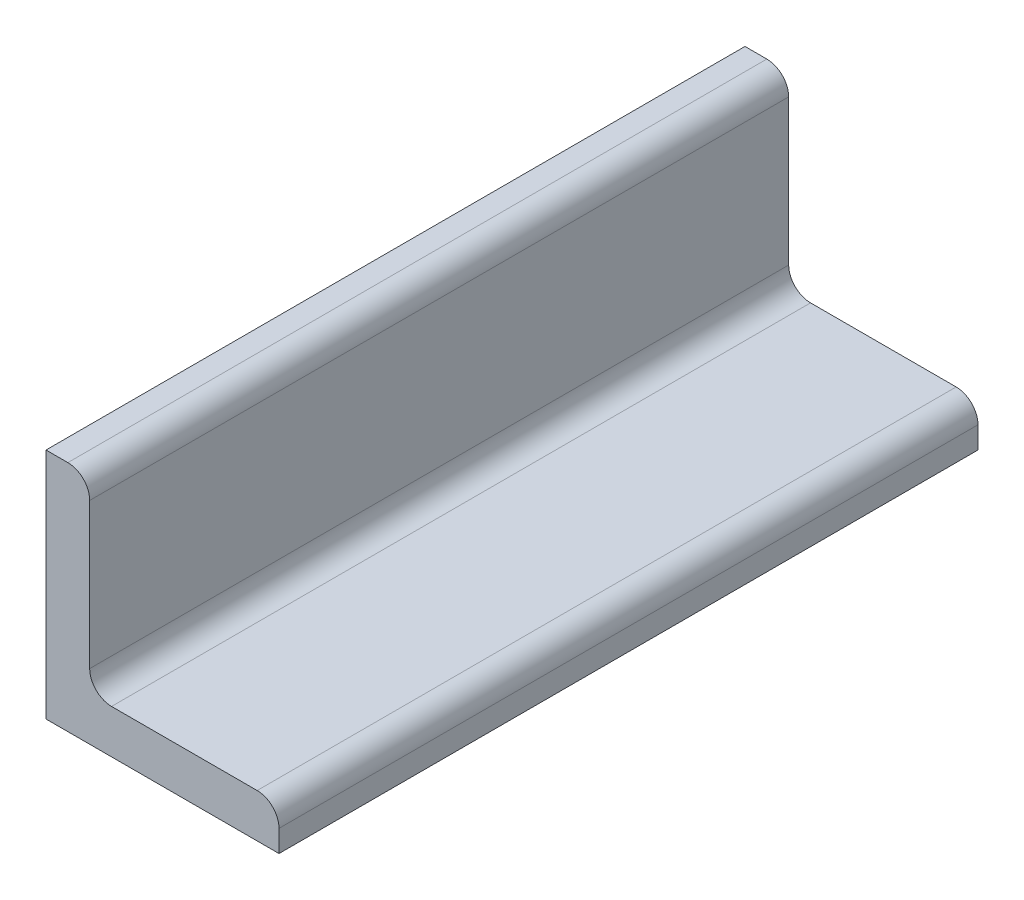
ISO-10303-21;
HEADER;
FILE_DESCRIPTION(('STEP AP214'),'2;1');
FILE_NAME('part.step','',(''),(''),'','','');
FILE_SCHEMA(('AUTOMOTIVE_DESIGN { 1 0 10303 214 1 1 1 1 }'));
ENDSEC;
DATA;
#1=APPLICATION_CONTEXT('core data for automotive mechanical design processes');
#2=APPLICATION_PROTOCOL_DEFINITION('international standard','automotive_design',2000,#1);
#3=PRODUCT_CONTEXT('',#1,'mechanical');
#4=PRODUCT('Part','Part','',(#3));
#5=PRODUCT_RELATED_PRODUCT_CATEGORY('part','',(#4));
#6=PRODUCT_DEFINITION_FORMATION('','',#4);
#7=PRODUCT_DEFINITION_CONTEXT('part definition',#1,'design');
#8=PRODUCT_DEFINITION('design','',#6,#7);
#9=PRODUCT_DEFINITION_SHAPE('','',#8);
#10=(LENGTH_UNIT() NAMED_UNIT(*) SI_UNIT(.MILLI.,.METRE.));
#11=(NAMED_UNIT(*) PLANE_ANGLE_UNIT() SI_UNIT($,.RADIAN.));
#12=(NAMED_UNIT(*) SI_UNIT($,.STERADIAN.) SOLID_ANGLE_UNIT());
#13=UNCERTAINTY_MEASURE_WITH_UNIT(LENGTH_MEASURE(1.E-05),#10,'distance_accuracy_value','');
#14=(GEOMETRIC_REPRESENTATION_CONTEXT(3) GLOBAL_UNCERTAINTY_ASSIGNED_CONTEXT((#13)) GLOBAL_UNIT_ASSIGNED_CONTEXT((#10,
#11,#12)) REPRESENTATION_CONTEXT('',''));
#15=CARTESIAN_POINT('',(0.,0.,0.));
#16=DIRECTION('',(0.,0.,1.));
#17=DIRECTION('',(1.,0.,0.));
#18=AXIS2_PLACEMENT_3D('',#15,#16,#17);
#19=CARTESIAN_POINT('',(0.865045893659089,102.172018782971,304.8));
#20=DIRECTION('',(1.,0.,0.));
#21=DIRECTION('',(0.,0.,-1.));
#22=AXIS2_PLACEMENT_3D('',#19,#20,#21);
#23=PLANE('',#22);
#24=DIRECTION('',(0.,-1.,0.));
#25=VECTOR('',#24,1.);
#26=CARTESIAN_POINT('',(0.865045893659089,102.172018782971,0.));
#27=LINE('',#26,#25);
#28=CARTESIAN_POINT('',(0.865045893659089,102.172018782971,0.));
#29=VERTEX_POINT('',#28);
#30=CARTESIAN_POINT('',(0.865045893659089,0.572018782971054,0.));
#31=VERTEX_POINT('',#30);
#32=EDGE_CURVE('E135',#29,#31,#27,.T.);
#33=ORIENTED_EDGE('',*,*,#32,.T.);
#34=DIRECTION('',(0.,0.,-1.));
#35=VECTOR('',#34,1.);
#36=CARTESIAN_POINT('',(0.865045893659089,0.572018782971054,304.8));
#37=LINE('',#36,#35);
#38=CARTESIAN_POINT('',(0.865045893659089,0.572018782971054,304.8));
#39=VERTEX_POINT('',#38);
#40=EDGE_CURVE('E11',#39,#31,#37,.T.);
#41=ORIENTED_EDGE('',*,*,#40,.F.);
#42=DIRECTION('',(0.,-1.,0.));
#43=VECTOR('',#42,1.);
#44=CARTESIAN_POINT('',(0.865045893659089,102.172018782971,304.8));
#45=LINE('',#44,#43);
#46=CARTESIAN_POINT('',(0.865045893659089,102.172018782971,304.8));
#47=VERTEX_POINT('',#46);
#48=EDGE_CURVE('E151',#47,#39,#45,.T.);
#49=ORIENTED_EDGE('',*,*,#48,.F.);
#50=DIRECTION('',(0.,0.,-1.));
#51=VECTOR('',#50,1.);
#52=CARTESIAN_POINT('',(0.865045893659089,102.172018782971,304.8));
#53=LINE('',#52,#51);
#54=EDGE_CURVE('E131',#47,#29,#53,.T.);
#55=ORIENTED_EDGE('',*,*,#54,.T.);
#56=EDGE_LOOP('',(#33,#41,#49,#55));
#57=FACE_BOUND('',#56,.T.);
#58=ADVANCED_FACE('F33',(#57),#23,.F.);
#59=CARTESIAN_POINT('',(0.865045893659089,0.572018782971054,304.8));
#60=DIRECTION('',(0.,1.,0.));
#61=DIRECTION('',(0.,0.,1.));
#62=AXIS2_PLACEMENT_3D('',#59,#60,#61);
#63=PLANE('',#62);
#64=DIRECTION('',(1.,0.,0.));
#65=VECTOR('',#64,1.);
#66=CARTESIAN_POINT('',(0.865045893659089,0.572018782971054,0.));
#67=LINE('',#66,#65);
#68=CARTESIAN_POINT('',(102.465045893659,0.572018782971054,0.));
#69=VERTEX_POINT('',#68);
#70=EDGE_CURVE('E138',#31,#69,#67,.T.);
#71=ORIENTED_EDGE('',*,*,#70,.T.);
#72=DIRECTION('',(0.,0.,-1.));
#73=VECTOR('',#72,1.);
#74=CARTESIAN_POINT('',(102.465045893659,0.572018782971054,304.8));
#75=LINE('',#74,#73);
#76=CARTESIAN_POINT('',(102.465045893659,0.572018782971054,304.8));
#77=VERTEX_POINT('',#76);
#78=EDGE_CURVE('E41',#77,#69,#75,.T.);
#79=ORIENTED_EDGE('',*,*,#78,.F.);
#80=DIRECTION('',(1.,0.,0.));
#81=VECTOR('',#80,1.);
#82=CARTESIAN_POINT('',(0.865045893659089,0.572018782971054,304.8));
#83=LINE('',#82,#81);
#84=EDGE_CURVE('E95',#39,#77,#83,.T.);
#85=ORIENTED_EDGE('',*,*,#84,.F.);
#86=ORIENTED_EDGE('',*,*,#40,.T.);
#87=EDGE_LOOP('',(#71,#79,#85,#86));
#88=FACE_BOUND('',#87,.T.);
#89=ADVANCED_FACE('F194',(#88),#63,.F.);
#90=CARTESIAN_POINT('',(102.465045893659,0.572018782971054,304.8));
#91=DIRECTION('',(-1.,0.,0.));
#92=DIRECTION('',(0.,0.,1.));
#93=AXIS2_PLACEMENT_3D('',#90,#91,#92);
#94=PLANE('',#93);
#95=DIRECTION('',(0.,1.,0.));
#96=VECTOR('',#95,1.);
#97=CARTESIAN_POINT('',(102.465045893659,0.572018782971054,0.));
#98=LINE('',#97,#96);
#99=CARTESIAN_POINT('',(102.465045893659,10.0970187829711,0.));
#100=VERTEX_POINT('',#99);
#101=EDGE_CURVE('E140',#69,#100,#98,.T.);
#102=ORIENTED_EDGE('',*,*,#101,.T.);
#103=DIRECTION('',(0.,0.,-1.));
#104=VECTOR('',#103,1.);
#105=CARTESIAN_POINT('',(102.465045893659,10.0970187829711,304.8));
#106=LINE('',#105,#104);
#107=CARTESIAN_POINT('',(102.465045893659,10.0970187829711,304.8));
#108=VERTEX_POINT('',#107);
#109=EDGE_CURVE('E161',#108,#100,#106,.T.);
#110=ORIENTED_EDGE('',*,*,#109,.F.);
#111=DIRECTION('',(0.,1.,0.));
#112=VECTOR('',#111,1.);
#113=CARTESIAN_POINT('',(102.465045893659,0.572018782971054,304.8));
#114=LINE('',#113,#112);
#115=EDGE_CURVE('E169',#77,#108,#114,.T.);
#116=ORIENTED_EDGE('',*,*,#115,.F.);
#117=ORIENTED_EDGE('',*,*,#78,.T.);
#118=EDGE_LOOP('',(#102,#110,#116,#117));
#119=FACE_BOUND('',#118,.T.);
#120=ADVANCED_FACE('F167',(#119),#94,.F.);
#121=CARTESIAN_POINT('',(92.9400458936591,10.097018782971,304.8));
#122=DIRECTION('',(0.,0.,-1.));
#123=DIRECTION('',(-1.,0.,0.));
#124=AXIS2_PLACEMENT_3D('',#121,#122,#123);
#125=CYLINDRICAL_SURFACE('',#124,9.52500000000001);
#126=CARTESIAN_POINT('',(92.9400458936591,10.097018782971,0.));
#127=DIRECTION('',(0.,0.,1.));
#128=DIRECTION('',(1.,0.,0.));
#129=AXIS2_PLACEMENT_3D('',#126,#127,#128);
#130=CIRCLE('',#129,9.52500000000001);
#131=CARTESIAN_POINT('',(92.9400458936591,19.6220187829711,0.));
#132=VERTEX_POINT('',#131);
#133=EDGE_CURVE('E142',#100,#132,#130,.T.);
#134=ORIENTED_EDGE('',*,*,#133,.T.);
#135=DIRECTION('',(0.,0.,-1.));
#136=VECTOR('',#135,1.);
#137=CARTESIAN_POINT('',(92.9400458936591,19.6220187829711,304.8));
#138=LINE('',#137,#136);
#139=CARTESIAN_POINT('',(92.9400458936591,19.6220187829711,304.8));
#140=VERTEX_POINT('',#139);
#141=EDGE_CURVE('E158',#140,#132,#138,.T.);
#142=ORIENTED_EDGE('',*,*,#141,.F.);
#143=CARTESIAN_POINT('',(92.9400458936591,10.097018782971,304.8));
#144=DIRECTION('',(0.,0.,1.));
#145=DIRECTION('',(1.,0.,0.));
#146=AXIS2_PLACEMENT_3D('',#143,#144,#145);
#147=CIRCLE('',#146,9.52500000000001);
#148=EDGE_CURVE('E185',#108,#140,#147,.T.);
#149=ORIENTED_EDGE('',*,*,#148,.F.);
#150=ORIENTED_EDGE('',*,*,#109,.T.);
#151=EDGE_LOOP('',(#134,#142,#149,#150));
#152=FACE_BOUND('',#151,.T.);
#153=ADVANCED_FACE('F178',(#152),#125,.T.);
#154=CARTESIAN_POINT('',(92.9400458936591,19.6220187829711,304.8));
#155=DIRECTION('',(0.,-1.,0.));
#156=DIRECTION('',(0.,0.,-1.));
#157=AXIS2_PLACEMENT_3D('',#154,#155,#156);
#158=PLANE('',#157);
#159=DIRECTION('',(-1.,0.,0.));
#160=VECTOR('',#159,1.);
#161=CARTESIAN_POINT('',(92.9400458936591,19.6220187829711,0.));
#162=LINE('',#161,#160);
#163=CARTESIAN_POINT('',(29.4400458936591,19.6220187829711,0.));
#164=VERTEX_POINT('',#163);
#165=EDGE_CURVE('E144',#132,#164,#162,.T.);
#166=ORIENTED_EDGE('',*,*,#165,.T.);
#167=DIRECTION('',(0.,0.,-1.));
#168=VECTOR('',#167,1.);
#169=CARTESIAN_POINT('',(29.4400458936591,19.6220187829711,304.8));
#170=LINE('',#169,#168);
#171=CARTESIAN_POINT('',(29.4400458936591,19.6220187829711,304.8));
#172=VERTEX_POINT('',#171);
#173=EDGE_CURVE('E155',#172,#164,#170,.T.);
#174=ORIENTED_EDGE('',*,*,#173,.F.);
#175=DIRECTION('',(-1.,0.,0.));
#176=VECTOR('',#175,1.);
#177=CARTESIAN_POINT('',(92.9400458936591,19.6220187829711,304.8));
#178=LINE('',#177,#176);
#179=EDGE_CURVE('E184',#140,#172,#178,.T.);
#180=ORIENTED_EDGE('',*,*,#179,.F.);
#181=ORIENTED_EDGE('',*,*,#141,.T.);
#182=EDGE_LOOP('',(#166,#174,#180,#181));
#183=FACE_BOUND('',#182,.T.);
#184=ADVANCED_FACE('F182',(#183),#158,.F.);
#185=CARTESIAN_POINT('',(29.4400458936591,29.147018782971,304.8));
#186=DIRECTION('',(0.,0.,-1.));
#187=DIRECTION('',(-1.,0.,0.));
#188=AXIS2_PLACEMENT_3D('',#185,#186,#187);
#189=CYLINDRICAL_SURFACE('',#188,9.52499999999999);
#190=CARTESIAN_POINT('',(29.4400458936591,29.147018782971,0.));
#191=DIRECTION('',(0.,0.,-1.));
#192=DIRECTION('',(1.,0.,0.));
#193=AXIS2_PLACEMENT_3D('',#190,#191,#192);
#194=CIRCLE('',#193,9.52499999999999);
#195=CARTESIAN_POINT('',(19.9150458936591,29.1470187829711,0.));
#196=VERTEX_POINT('',#195);
#197=EDGE_CURVE('E146',#164,#196,#194,.T.);
#198=ORIENTED_EDGE('',*,*,#197,.T.);
#199=DIRECTION('',(0.,0.,-1.));
#200=VECTOR('',#199,1.);
#201=CARTESIAN_POINT('',(19.9150458936591,29.1470187829711,304.8));
#202=LINE('',#201,#200);
#203=CARTESIAN_POINT('',(19.9150458936591,29.1470187829711,304.8));
#204=VERTEX_POINT('',#203);
#205=EDGE_CURVE('E126',#204,#196,#202,.T.);
#206=ORIENTED_EDGE('',*,*,#205,.F.);
#207=CARTESIAN_POINT('',(29.4400458936591,29.147018782971,304.8));
#208=DIRECTION('',(0.,0.,-1.));
#209=DIRECTION('',(1.,0.,0.));
#210=AXIS2_PLACEMENT_3D('',#207,#208,#209);
#211=CIRCLE('',#210,9.52499999999999);
#212=EDGE_CURVE('E117',#172,#204,#211,.T.);
#213=ORIENTED_EDGE('',*,*,#212,.F.);
#214=ORIENTED_EDGE('',*,*,#173,.T.);
#215=EDGE_LOOP('',(#198,#206,#213,#214));
#216=FACE_BOUND('',#215,.T.);
#217=ADVANCED_FACE('F206',(#216),#189,.F.);
#218=CARTESIAN_POINT('',(19.9150458936591,29.1470187829711,304.8));
#219=DIRECTION('',(-1.,0.,0.));
#220=DIRECTION('',(0.,0.,1.));
#221=AXIS2_PLACEMENT_3D('',#218,#219,#220);
#222=PLANE('',#221);
#223=DIRECTION('',(0.,1.,0.));
#224=VECTOR('',#223,1.);
#225=CARTESIAN_POINT('',(19.9150458936591,29.1470187829711,0.));
#226=LINE('',#225,#224);
#227=CARTESIAN_POINT('',(19.9150458936591,92.6470187829711,0.));
#228=VERTEX_POINT('',#227);
#229=EDGE_CURVE('E125',#196,#228,#226,.T.);
#230=ORIENTED_EDGE('',*,*,#229,.T.);
#231=DIRECTION('',(0.,0.,-1.));
#232=VECTOR('',#231,1.);
#233=CARTESIAN_POINT('',(19.9150458936591,92.6470187829711,304.8));
#234=LINE('',#233,#232);
#235=CARTESIAN_POINT('',(19.9150458936591,92.6470187829711,304.8));
#236=VERTEX_POINT('',#235);
#237=EDGE_CURVE('E122',#236,#228,#234,.T.);
#238=ORIENTED_EDGE('',*,*,#237,.F.);
#239=DIRECTION('',(0.,1.,0.));
#240=VECTOR('',#239,1.);
#241=CARTESIAN_POINT('',(19.9150458936591,29.1470187829711,304.8));
#242=LINE('',#241,#240);
#243=EDGE_CURVE('E111',#204,#236,#242,.T.);
#244=ORIENTED_EDGE('',*,*,#243,.F.);
#245=ORIENTED_EDGE('',*,*,#205,.T.);
#246=EDGE_LOOP('',(#230,#238,#244,#245));
#247=FACE_BOUND('',#246,.T.);
#248=ADVANCED_FACE('F123',(#247),#222,.F.);
#249=CARTESIAN_POINT('',(10.3900458936591,92.647018782971,304.8));
#250=DIRECTION('',(0.,0.,-1.));
#251=DIRECTION('',(-1.,0.,0.));
#252=AXIS2_PLACEMENT_3D('',#249,#250,#251);
#253=CYLINDRICAL_SURFACE('',#252,9.52499999999999);
#254=CARTESIAN_POINT('',(10.3900458936591,92.647018782971,0.));
#255=DIRECTION('',(0.,0.,1.));
#256=DIRECTION('',(1.,0.,0.));
#257=AXIS2_PLACEMENT_3D('',#254,#255,#256);
#258=CIRCLE('',#257,9.52499999999999);
#259=CARTESIAN_POINT('',(10.3900458936591,102.172018782971,0.));
#260=VERTEX_POINT('',#259);
#261=EDGE_CURVE('E81',#228,#260,#258,.T.);
#262=ORIENTED_EDGE('',*,*,#261,.T.);
#263=DIRECTION('',(0.,0.,-1.));
#264=VECTOR('',#263,1.);
#265=CARTESIAN_POINT('',(10.3900458936591,102.172018782971,304.8));
#266=LINE('',#265,#264);
#267=CARTESIAN_POINT('',(10.3900458936591,102.172018782971,304.8));
#268=VERTEX_POINT('',#267);
#269=EDGE_CURVE('E127',#268,#260,#266,.T.);
#270=ORIENTED_EDGE('',*,*,#269,.F.);
#271=CARTESIAN_POINT('',(10.3900458936591,92.647018782971,304.8));
#272=DIRECTION('',(0.,0.,1.));
#273=DIRECTION('',(1.,0.,0.));
#274=AXIS2_PLACEMENT_3D('',#271,#272,#273);
#275=CIRCLE('',#274,9.52499999999999);
#276=EDGE_CURVE('E115',#236,#268,#275,.T.);
#277=ORIENTED_EDGE('',*,*,#276,.F.);
#278=ORIENTED_EDGE('',*,*,#237,.T.);
#279=EDGE_LOOP('',(#262,#270,#277,#278));
#280=FACE_BOUND('',#279,.T.);
#281=ADVANCED_FACE('F129',(#280),#253,.T.);
#282=CARTESIAN_POINT('',(10.3900458936591,102.172018782971,304.8));
#283=DIRECTION('',(0.,-1.,0.));
#284=DIRECTION('',(0.,0.,-1.));
#285=AXIS2_PLACEMENT_3D('',#282,#283,#284);
#286=PLANE('',#285);
#287=DIRECTION('',(-1.,0.,0.));
#288=VECTOR('',#287,1.);
#289=CARTESIAN_POINT('',(10.3900458936591,102.172018782971,0.));
#290=LINE('',#289,#288);
#291=EDGE_CURVE('E87',#260,#29,#290,.T.);
#292=ORIENTED_EDGE('',*,*,#291,.T.);
#293=ORIENTED_EDGE('',*,*,#54,.F.);
#294=DIRECTION('',(-1.,0.,0.));
#295=VECTOR('',#294,1.);
#296=CARTESIAN_POINT('',(10.3900458936591,102.172018782971,304.8));
#297=LINE('',#296,#295);
#298=EDGE_CURVE('E49',#268,#47,#297,.T.);
#299=ORIENTED_EDGE('',*,*,#298,.F.);
#300=ORIENTED_EDGE('',*,*,#269,.T.);
#301=EDGE_LOOP('',(#292,#293,#299,#300));
#302=FACE_BOUND('',#301,.T.);
#303=ADVANCED_FACE('F214',(#302),#286,.F.);
#304=CARTESIAN_POINT('',(92.9400458936591,10.097018782971,304.8));
#305=DIRECTION('',(0.,0.,1.));
#306=DIRECTION('',(1.,0.,0.));
#307=AXIS2_PLACEMENT_3D('',#304,#305,#306);
#308=PLANE('',#307);
#309=ORIENTED_EDGE('',*,*,#48,.T.);
#310=ORIENTED_EDGE('',*,*,#84,.T.);
#311=ORIENTED_EDGE('',*,*,#115,.T.);
#312=ORIENTED_EDGE('',*,*,#148,.T.);
#313=ORIENTED_EDGE('',*,*,#179,.T.);
#314=ORIENTED_EDGE('',*,*,#212,.T.);
#315=ORIENTED_EDGE('',*,*,#243,.T.);
#316=ORIENTED_EDGE('',*,*,#276,.T.);
#317=ORIENTED_EDGE('',*,*,#298,.T.);
#318=EDGE_LOOP('',(#309,#310,#311,#312,#313,#314,#315,#316,#317));
#319=FACE_BOUND('',#318,.T.);
#320=ADVANCED_FACE('F113',(#319),#308,.T.);
#321=CARTESIAN_POINT('',(92.9400458936591,10.097018782971,0.));
#322=DIRECTION('',(0.,0.,1.));
#323=DIRECTION('',(1.,0.,0.));
#324=AXIS2_PLACEMENT_3D('',#321,#322,#323);
#325=PLANE('',#324);
#326=ORIENTED_EDGE('',*,*,#32,.F.);
#327=ORIENTED_EDGE('',*,*,#291,.F.);
#328=ORIENTED_EDGE('',*,*,#261,.F.);
#329=ORIENTED_EDGE('',*,*,#229,.F.);
#330=ORIENTED_EDGE('',*,*,#197,.F.);
#331=ORIENTED_EDGE('',*,*,#165,.F.);
#332=ORIENTED_EDGE('',*,*,#133,.F.);
#333=ORIENTED_EDGE('',*,*,#101,.F.);
#334=ORIENTED_EDGE('',*,*,#70,.F.);
#335=EDGE_LOOP('',(#326,#327,#328,#329,#330,#331,#332,#333,#334));
#336=FACE_BOUND('',#335,.T.);
#337=ADVANCED_FACE('F173',(#336),#325,.F.);
#338=CLOSED_SHELL('',(#58,#89,#120,#153,#184,#217,#248,#281,#303,#320,#337));
#339=MANIFOLD_SOLID_BREP('B2',#338);
#340=ADVANCED_BREP_SHAPE_REPRESENTATION('',(#18,#339),#14);
#341=SHAPE_DEFINITION_REPRESENTATION(#9,#340);
ENDSEC;
END-ISO-10303-21;
